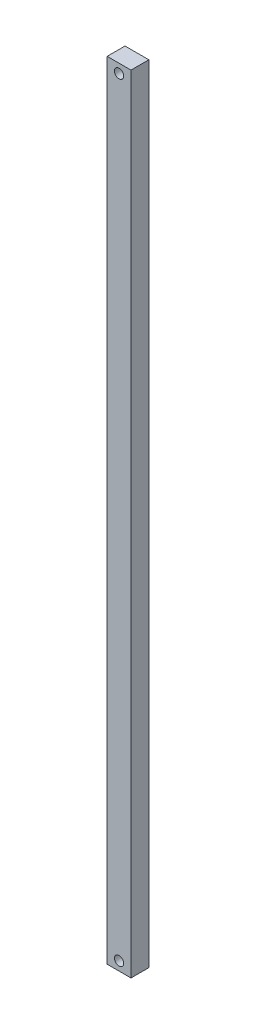
ISO-10303-21;
HEADER;
FILE_DESCRIPTION(('STEP AP214'),'2;1');
FILE_NAME('part.step','',(''),(''),'','','');
FILE_SCHEMA(('AUTOMOTIVE_DESIGN { 1 0 10303 214 1 1 1 1 }'));
ENDSEC;
DATA;
#1=APPLICATION_CONTEXT('core data for automotive mechanical design processes');
#2=APPLICATION_PROTOCOL_DEFINITION('international standard','automotive_design',2000,#1);
#3=PRODUCT_CONTEXT('',#1,'mechanical');
#4=PRODUCT('Part','Part','',(#3));
#5=PRODUCT_RELATED_PRODUCT_CATEGORY('part','',(#4));
#6=PRODUCT_DEFINITION_FORMATION('','',#4);
#7=PRODUCT_DEFINITION_CONTEXT('part definition',#1,'design');
#8=PRODUCT_DEFINITION('design','',#6,#7);
#9=PRODUCT_DEFINITION_SHAPE('','',#8);
#10=(LENGTH_UNIT() NAMED_UNIT(*) SI_UNIT(.MILLI.,.METRE.));
#11=(NAMED_UNIT(*) PLANE_ANGLE_UNIT() SI_UNIT($,.RADIAN.));
#12=(NAMED_UNIT(*) SI_UNIT($,.STERADIAN.) SOLID_ANGLE_UNIT());
#13=UNCERTAINTY_MEASURE_WITH_UNIT(LENGTH_MEASURE(1.E-05),#10,'distance_accuracy_value','');
#14=(GEOMETRIC_REPRESENTATION_CONTEXT(3) GLOBAL_UNCERTAINTY_ASSIGNED_CONTEXT((#13)) GLOBAL_UNIT_ASSIGNED_CONTEXT((#10,
#11,#12)) REPRESENTATION_CONTEXT('',''));
#15=CARTESIAN_POINT('',(0.,0.,0.));
#16=DIRECTION('',(0.,0.,1.));
#17=DIRECTION('',(1.,0.,0.));
#18=AXIS2_PLACEMENT_3D('',#15,#16,#17);
#19=CARTESIAN_POINT('',(-6.71888068989518,419.1,-7.52978008350322));
#20=DIRECTION('',(1.,0.,0.));
#21=DIRECTION('',(0.,0.,-1.));
#22=AXIS2_PLACEMENT_3D('',#19,#20,#21);
#23=PLANE('',#22);
#24=DIRECTION('',(0.,0.,1.));
#25=VECTOR('',#24,1.);
#26=CARTESIAN_POINT('',(-6.71888068989518,0.,-7.52978008350322));
#27=LINE('',#26,#25);
#28=CARTESIAN_POINT('',(-6.71888068989518,0.,-7.52978008350322));
#29=VERTEX_POINT('',#28);
#30=CARTESIAN_POINT('',(-6.71888068989518,0.,1.99521991649678));
#31=VERTEX_POINT('',#30);
#32=EDGE_CURVE('E96',#29,#31,#27,.T.);
#33=ORIENTED_EDGE('',*,*,#32,.T.);
#34=DIRECTION('',(0.,-1.,0.));
#35=VECTOR('',#34,1.);
#36=CARTESIAN_POINT('',(-6.71888068989518,419.1,1.99521991649678));
#37=LINE('',#36,#35);
#38=CARTESIAN_POINT('',(-6.71888068989518,419.1,1.99521991649678));
#39=VERTEX_POINT('',#38);
#40=EDGE_CURVE('E11',#39,#31,#37,.T.);
#41=ORIENTED_EDGE('',*,*,#40,.F.);
#42=DIRECTION('',(0.,0.,1.));
#43=VECTOR('',#42,1.);
#44=CARTESIAN_POINT('',(-6.71888068989518,419.1,-7.52978008350322));
#45=LINE('',#44,#43);
#46=CARTESIAN_POINT('',(-6.71888068989518,419.1,-7.52978008350322));
#47=VERTEX_POINT('',#46);
#48=EDGE_CURVE('E84',#47,#39,#45,.T.);
#49=ORIENTED_EDGE('',*,*,#48,.F.);
#50=DIRECTION('',(0.,-1.,0.));
#51=VECTOR('',#50,1.);
#52=CARTESIAN_POINT('',(-6.71888068989518,419.1,-7.52978008350322));
#53=LINE('',#52,#51);
#54=EDGE_CURVE('E92',#47,#29,#53,.T.);
#55=ORIENTED_EDGE('',*,*,#54,.T.);
#56=EDGE_LOOP('',(#33,#41,#49,#55));
#57=FACE_BOUND('',#56,.T.);
#58=ADVANCED_FACE('F33',(#57),#23,.F.);
#59=CARTESIAN_POINT('',(-6.71888068989518,419.1,1.99521991649678));
#60=DIRECTION('',(0.,0.,-1.));
#61=DIRECTION('',(-1.,0.,0.));
#62=AXIS2_PLACEMENT_3D('',#59,#60,#61);
#63=PLANE('',#62);
#64=CARTESIAN_POINT('',(-0.368880689895179,414.3375,1.99521991649678));
#65=DIRECTION('',(0.,0.,-1.));
#66=DIRECTION('',(-1.,0.,0.));
#67=AXIS2_PLACEMENT_3D('',#64,#65,#66);
#68=CIRCLE('',#67,2.45745);
#69=CARTESIAN_POINT('',(-2.82633068989518,414.3375,1.99521991649678));
#70=VERTEX_POINT('',#69);
#71=EDGE_CURVE('E121',#70,#70,#68,.T.);
#72=ORIENTED_EDGE('',*,*,#71,.T.);
#73=EDGE_LOOP('',(#72));
#74=FACE_BOUND('',#73,.T.);
#75=CARTESIAN_POINT('',(-0.368880689895179,4.7625,1.99521991649678));
#76=DIRECTION('',(0.,0.,-1.));
#77=DIRECTION('',(-1.,0.,0.));
#78=AXIS2_PLACEMENT_3D('',#75,#76,#77);
#79=CIRCLE('',#78,2.45745);
#80=CARTESIAN_POINT('',(-2.82633068989518,4.7625,1.99521991649678));
#81=VERTEX_POINT('',#80);
#82=EDGE_CURVE('E99',#81,#81,#79,.T.);
#83=ORIENTED_EDGE('',*,*,#82,.T.);
#84=EDGE_LOOP('',(#83));
#85=FACE_BOUND('',#84,.T.);
#86=DIRECTION('',(1.,0.,0.));
#87=VECTOR('',#86,1.);
#88=CARTESIAN_POINT('',(-6.71888068989518,0.,1.99521991649678));
#89=LINE('',#88,#87);
#90=CARTESIAN_POINT('',(5.98111931010482,0.,1.99521991649678));
#91=VERTEX_POINT('',#90);
#92=EDGE_CURVE('E88',#31,#91,#89,.T.);
#93=ORIENTED_EDGE('',*,*,#92,.T.);
#94=DIRECTION('',(0.,-1.,0.));
#95=VECTOR('',#94,1.);
#96=CARTESIAN_POINT('',(5.98111931010482,419.1,1.99521991649678));
#97=LINE('',#96,#95);
#98=CARTESIAN_POINT('',(5.98111931010482,419.1,1.99521991649678));
#99=VERTEX_POINT('',#98);
#100=EDGE_CURVE('E41',#99,#91,#97,.T.);
#101=ORIENTED_EDGE('',*,*,#100,.F.);
#102=DIRECTION('',(1.,0.,0.));
#103=VECTOR('',#102,1.);
#104=CARTESIAN_POINT('',(-6.71888068989518,419.1,1.99521991649678));
#105=LINE('',#104,#103);
#106=EDGE_CURVE('E79',#39,#99,#105,.T.);
#107=ORIENTED_EDGE('',*,*,#106,.F.);
#108=ORIENTED_EDGE('',*,*,#40,.T.);
#109=EDGE_LOOP('',(#93,#101,#107,#108));
#110=FACE_BOUND('',#109,.T.);
#111=ADVANCED_FACE('F87',(#74,#85,#110),#63,.F.);
#112=CARTESIAN_POINT('',(5.98111931010482,419.1,-7.52978008350322));
#113=DIRECTION('',(-1.,0.,0.));
#114=DIRECTION('',(0.,0.,1.));
#115=AXIS2_PLACEMENT_3D('',#112,#113,#114);
#116=PLANE('',#115);
#117=DIRECTION('',(0.,0.,-1.));
#118=VECTOR('',#117,1.);
#119=CARTESIAN_POINT('',(5.98111931010482,0.,-7.52978008350322));
#120=LINE('',#119,#118);
#121=CARTESIAN_POINT('',(5.98111931010482,0.,-7.52978008350322));
#122=VERTEX_POINT('',#121);
#123=EDGE_CURVE('E66',#91,#122,#120,.T.);
#124=ORIENTED_EDGE('',*,*,#123,.T.);
#125=DIRECTION('',(0.,-1.,0.));
#126=VECTOR('',#125,1.);
#127=CARTESIAN_POINT('',(5.98111931010482,419.1,-7.52978008350322));
#128=LINE('',#127,#126);
#129=CARTESIAN_POINT('',(5.98111931010482,419.1,-7.52978008350322));
#130=VERTEX_POINT('',#129);
#131=EDGE_CURVE('E89',#130,#122,#128,.T.);
#132=ORIENTED_EDGE('',*,*,#131,.F.);
#133=DIRECTION('',(0.,0.,-1.));
#134=VECTOR('',#133,1.);
#135=CARTESIAN_POINT('',(5.98111931010482,419.1,-7.52978008350322));
#136=LINE('',#135,#134);
#137=EDGE_CURVE('E82',#99,#130,#136,.T.);
#138=ORIENTED_EDGE('',*,*,#137,.F.);
#139=ORIENTED_EDGE('',*,*,#100,.T.);
#140=EDGE_LOOP('',(#124,#132,#138,#139));
#141=FACE_BOUND('',#140,.T.);
#142=ADVANCED_FACE('F90',(#141),#116,.F.);
#143=CARTESIAN_POINT('',(-6.71888068989518,419.1,-7.52978008350322));
#144=DIRECTION('',(0.,0.,1.));
#145=DIRECTION('',(1.,0.,0.));
#146=AXIS2_PLACEMENT_3D('',#143,#144,#145);
#147=PLANE('',#146);
#148=CARTESIAN_POINT('',(-0.368880689895179,414.3375,-7.52978008350322));
#149=DIRECTION('',(0.,0.,-1.));
#150=DIRECTION('',(-1.,0.,0.));
#151=AXIS2_PLACEMENT_3D('',#148,#149,#150);
#152=CIRCLE('',#151,3.96875);
#153=CARTESIAN_POINT('',(-4.33763068989518,414.3375,-7.52978008350322));
#154=VERTEX_POINT('',#153);
#155=EDGE_CURVE('E130',#154,#154,#152,.T.);
#156=ORIENTED_EDGE('',*,*,#155,.F.);
#157=EDGE_LOOP('',(#156));
#158=FACE_BOUND('',#157,.T.);
#159=CARTESIAN_POINT('',(-0.368880689895179,4.7625,-7.52978008350322));
#160=DIRECTION('',(0.,0.,-1.));
#161=DIRECTION('',(-1.,0.,0.));
#162=AXIS2_PLACEMENT_3D('',#159,#160,#161);
#163=CIRCLE('',#162,3.96875);
#164=CARTESIAN_POINT('',(-4.33763068989518,4.7625,-7.52978008350322));
#165=VERTEX_POINT('',#164);
#166=EDGE_CURVE('E118',#165,#165,#163,.T.);
#167=ORIENTED_EDGE('',*,*,#166,.F.);
#168=EDGE_LOOP('',(#167));
#169=FACE_BOUND('',#168,.T.);
#170=DIRECTION('',(-1.,0.,0.));
#171=VECTOR('',#170,1.);
#172=CARTESIAN_POINT('',(-6.71888068989518,0.,-7.52978008350322));
#173=LINE('',#172,#171);
#174=EDGE_CURVE('E72',#122,#29,#173,.T.);
#175=ORIENTED_EDGE('',*,*,#174,.T.);
#176=ORIENTED_EDGE('',*,*,#54,.F.);
#177=DIRECTION('',(-1.,0.,0.));
#178=VECTOR('',#177,1.);
#179=CARTESIAN_POINT('',(-6.71888068989518,419.1,-7.52978008350322));
#180=LINE('',#179,#178);
#181=EDGE_CURVE('E49',#130,#47,#180,.T.);
#182=ORIENTED_EDGE('',*,*,#181,.F.);
#183=ORIENTED_EDGE('',*,*,#131,.T.);
#184=EDGE_LOOP('',(#175,#176,#182,#183));
#185=FACE_BOUND('',#184,.T.);
#186=ADVANCED_FACE('F104',(#158,#169,#185),#147,.F.);
#187=CARTESIAN_POINT('',(0.,419.1,0.));
#188=DIRECTION('',(0.,1.,0.));
#189=DIRECTION('',(0.,0.,1.));
#190=AXIS2_PLACEMENT_3D('',#187,#188,#189);
#191=PLANE('',#190);
#192=ORIENTED_EDGE('',*,*,#48,.T.);
#193=ORIENTED_EDGE('',*,*,#106,.T.);
#194=ORIENTED_EDGE('',*,*,#137,.T.);
#195=ORIENTED_EDGE('',*,*,#181,.T.);
#196=EDGE_LOOP('',(#192,#193,#194,#195));
#197=FACE_BOUND('',#196,.T.);
#198=ADVANCED_FACE('F80',(#197),#191,.T.);
#199=CARTESIAN_POINT('',(0.,0.,0.));
#200=DIRECTION('',(0.,1.,0.));
#201=DIRECTION('',(0.,0.,1.));
#202=AXIS2_PLACEMENT_3D('',#199,#200,#201);
#203=PLANE('',#202);
#204=ORIENTED_EDGE('',*,*,#32,.F.);
#205=ORIENTED_EDGE('',*,*,#174,.F.);
#206=ORIENTED_EDGE('',*,*,#123,.F.);
#207=ORIENTED_EDGE('',*,*,#92,.F.);
#208=EDGE_LOOP('',(#204,#205,#206,#207));
#209=FACE_BOUND('',#208,.T.);
#210=ADVANCED_FACE('F107',(#209),#203,.F.);
#211=CARTESIAN_POINT('',(-0.368880689895179,4.7625,-7.52978008350322));
#212=DIRECTION('',(0.,0.,-1.));
#213=DIRECTION('',(-1.,0.,0.));
#214=AXIS2_PLACEMENT_3D('',#211,#212,#213);
#215=CYLINDRICAL_SURFACE('',#214,2.45745);
#216=ORIENTED_EDGE('',*,*,#82,.F.);
#217=EDGE_LOOP('',(#216));
#218=FACE_BOUND('',#217,.T.);
#219=CARTESIAN_POINT('',(-0.368880689895179,4.7625,-3.36418008350322));
#220=DIRECTION('',(0.,0.,-1.));
#221=DIRECTION('',(-1.,0.,0.));
#222=AXIS2_PLACEMENT_3D('',#219,#220,#221);
#223=CIRCLE('',#222,2.45745);
#224=CARTESIAN_POINT('',(-2.82633068989518,4.7625,-3.36418008350322));
#225=VERTEX_POINT('',#224);
#226=EDGE_CURVE('E112',#225,#225,#223,.T.);
#227=ORIENTED_EDGE('',*,*,#226,.T.);
#228=EDGE_LOOP('',(#227));
#229=FACE_BOUND('',#228,.T.);
#230=ADVANCED_FACE('F154',(#218,#229),#215,.F.);
#231=CARTESIAN_POINT('',(2.08856931010482,4.7625,-3.36418008350322));
#232=DIRECTION('',(0.,0.,1.));
#233=DIRECTION('',(1.,0.,0.));
#234=AXIS2_PLACEMENT_3D('',#231,#232,#233);
#235=PLANE('',#234);
#236=ORIENTED_EDGE('',*,*,#226,.F.);
#237=EDGE_LOOP('',(#236));
#238=FACE_BOUND('',#237,.T.);
#239=CARTESIAN_POINT('',(-0.368880689895179,4.7625,-3.36418008350322));
#240=DIRECTION('',(0.,0.,-1.));
#241=DIRECTION('',(-1.,0.,0.));
#242=AXIS2_PLACEMENT_3D('',#239,#240,#241);
#243=CIRCLE('',#242,3.96875);
#244=CARTESIAN_POINT('',(-4.33763068989518,4.7625,-3.36418008350322));
#245=VERTEX_POINT('',#244);
#246=EDGE_CURVE('E115',#245,#245,#243,.T.);
#247=ORIENTED_EDGE('',*,*,#246,.T.);
#248=EDGE_LOOP('',(#247));
#249=FACE_BOUND('',#248,.T.);
#250=ADVANCED_FACE('F144',(#238,#249),#235,.F.);
#251=CARTESIAN_POINT('',(-0.368880689895179,4.7625,-7.52978008350322));
#252=DIRECTION('',(0.,0.,-1.));
#253=DIRECTION('',(-1.,0.,0.));
#254=AXIS2_PLACEMENT_3D('',#251,#252,#253);
#255=CYLINDRICAL_SURFACE('',#254,3.96875);
#256=ORIENTED_EDGE('',*,*,#246,.F.);
#257=EDGE_LOOP('',(#256));
#258=FACE_BOUND('',#257,.T.);
#259=ORIENTED_EDGE('',*,*,#166,.T.);
#260=EDGE_LOOP('',(#259));
#261=FACE_BOUND('',#260,.T.);
#262=ADVANCED_FACE('F141',(#258,#261),#255,.F.);
#263=CARTESIAN_POINT('',(-0.368880689895179,414.3375,-7.52978008350322));
#264=DIRECTION('',(0.,0.,-1.));
#265=DIRECTION('',(-1.,0.,0.));
#266=AXIS2_PLACEMENT_3D('',#263,#264,#265);
#267=CYLINDRICAL_SURFACE('',#266,2.45745);
#268=ORIENTED_EDGE('',*,*,#71,.F.);
#269=EDGE_LOOP('',(#268));
#270=FACE_BOUND('',#269,.T.);
#271=CARTESIAN_POINT('',(-0.368880689895179,414.3375,-3.36418008350322));
#272=DIRECTION('',(0.,0.,-1.));
#273=DIRECTION('',(-1.,0.,0.));
#274=AXIS2_PLACEMENT_3D('',#271,#272,#273);
#275=CIRCLE('',#274,2.45745);
#276=CARTESIAN_POINT('',(-2.82633068989518,414.3375,-3.36418008350322));
#277=VERTEX_POINT('',#276);
#278=EDGE_CURVE('E124',#277,#277,#275,.T.);
#279=ORIENTED_EDGE('',*,*,#278,.T.);
#280=EDGE_LOOP('',(#279));
#281=FACE_BOUND('',#280,.T.);
#282=ADVANCED_FACE('F143',(#270,#281),#267,.F.);
#283=CARTESIAN_POINT('',(2.08856931010482,414.3375,-3.36418008350322));
#284=DIRECTION('',(0.,0.,1.));
#285=DIRECTION('',(1.,0.,0.));
#286=AXIS2_PLACEMENT_3D('',#283,#284,#285);
#287=PLANE('',#286);
#288=ORIENTED_EDGE('',*,*,#278,.F.);
#289=EDGE_LOOP('',(#288));
#290=FACE_BOUND('',#289,.T.);
#291=CARTESIAN_POINT('',(-0.368880689895179,414.3375,-3.36418008350322));
#292=DIRECTION('',(0.,0.,-1.));
#293=DIRECTION('',(-1.,0.,0.));
#294=AXIS2_PLACEMENT_3D('',#291,#292,#293);
#295=CIRCLE('',#294,3.96875);
#296=CARTESIAN_POINT('',(-4.33763068989518,414.3375,-3.36418008350322));
#297=VERTEX_POINT('',#296);
#298=EDGE_CURVE('E127',#297,#297,#295,.T.);
#299=ORIENTED_EDGE('',*,*,#298,.T.);
#300=EDGE_LOOP('',(#299));
#301=FACE_BOUND('',#300,.T.);
#302=ADVANCED_FACE('F151',(#290,#301),#287,.F.);
#303=CARTESIAN_POINT('',(-0.368880689895179,414.3375,-7.52978008350322));
#304=DIRECTION('',(0.,0.,-1.));
#305=DIRECTION('',(-1.,0.,0.));
#306=AXIS2_PLACEMENT_3D('',#303,#304,#305);
#307=CYLINDRICAL_SURFACE('',#306,3.96875);
#308=ORIENTED_EDGE('',*,*,#298,.F.);
#309=EDGE_LOOP('',(#308));
#310=FACE_BOUND('',#309,.T.);
#311=ORIENTED_EDGE('',*,*,#155,.T.);
#312=EDGE_LOOP('',(#311));
#313=FACE_BOUND('',#312,.T.);
#314=ADVANCED_FACE('F134',(#310,#313),#307,.F.);
#315=CLOSED_SHELL('',(#58,#111,#142,#186,#198,#210,#230,#250,#262,#282,#302,#314));
#316=MANIFOLD_SOLID_BREP('B2',#315);
#317=ADVANCED_BREP_SHAPE_REPRESENTATION('',(#18,#316),#14);
#318=SHAPE_DEFINITION_REPRESENTATION(#9,#317);
ENDSEC;
END-ISO-10303-21;
